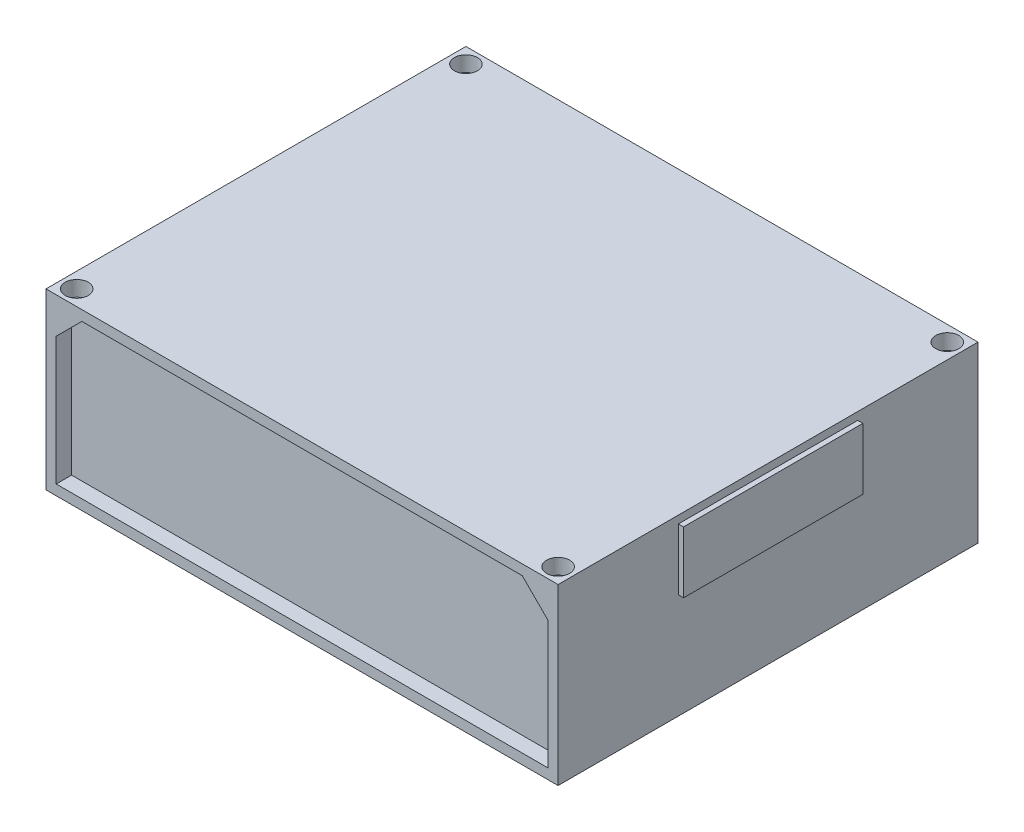
ISO-10303-21;
HEADER;
FILE_DESCRIPTION(('STEP AP214'),'2;1');
FILE_NAME('part.step','',(''),(''),'','','');
FILE_SCHEMA(('AUTOMOTIVE_DESIGN { 1 0 10303 214 1 1 1 1 }'));
ENDSEC;
DATA;
#1=APPLICATION_CONTEXT('core data for automotive mechanical design processes');
#2=APPLICATION_PROTOCOL_DEFINITION('international standard','automotive_design',2000,#1);
#3=PRODUCT_CONTEXT('',#1,'mechanical');
#4=PRODUCT('Part','Part','',(#3));
#5=PRODUCT_RELATED_PRODUCT_CATEGORY('part','',(#4));
#6=PRODUCT_DEFINITION_FORMATION('','',#4);
#7=PRODUCT_DEFINITION_CONTEXT('part definition',#1,'design');
#8=PRODUCT_DEFINITION('design','',#6,#7);
#9=PRODUCT_DEFINITION_SHAPE('','',#8);
#10=(LENGTH_UNIT() NAMED_UNIT(*) SI_UNIT(.MILLI.,.METRE.));
#11=(NAMED_UNIT(*) PLANE_ANGLE_UNIT() SI_UNIT($,.RADIAN.));
#12=(NAMED_UNIT(*) SI_UNIT($,.STERADIAN.) SOLID_ANGLE_UNIT());
#13=UNCERTAINTY_MEASURE_WITH_UNIT(LENGTH_MEASURE(1.E-05),#10,'distance_accuracy_value','');
#14=(GEOMETRIC_REPRESENTATION_CONTEXT(3) GLOBAL_UNCERTAINTY_ASSIGNED_CONTEXT((#13)) GLOBAL_UNIT_ASSIGNED_CONTEXT((#10,
#11,#12)) REPRESENTATION_CONTEXT('',''));
#15=CARTESIAN_POINT('',(0.,0.,0.));
#16=DIRECTION('',(0.,0.,1.));
#17=DIRECTION('',(1.,0.,0.));
#18=AXIS2_PLACEMENT_3D('',#15,#16,#17);
#19=CARTESIAN_POINT('',(100.,34.,0.));
#20=DIRECTION('',(-1.,0.,0.));
#21=DIRECTION('',(0.,0.,1.));
#22=AXIS2_PLACEMENT_3D('',#19,#20,#21);
#23=PLANE('',#22);
#24=DIRECTION('',(0.,0.,-1.));
#25=VECTOR('',#24,1.);
#26=CARTESIAN_POINT('',(100.,0.,0.));
#27=LINE('',#26,#25);
#28=CARTESIAN_POINT('',(100.,0.,0.));
#29=VERTEX_POINT('',#28);
#30=CARTESIAN_POINT('',(100.,0.,-82.));
#31=VERTEX_POINT('',#30);
#32=EDGE_CURVE('E342',#29,#31,#27,.T.);
#33=ORIENTED_EDGE('',*,*,#32,.T.);
#34=DIRECTION('',(0.,-1.,0.));
#35=VECTOR('',#34,1.);
#36=CARTESIAN_POINT('',(100.,34.,-82.));
#37=LINE('',#36,#35);
#38=CARTESIAN_POINT('',(100.,34.,-82.));
#39=VERTEX_POINT('',#38);
#40=EDGE_CURVE('E350',#39,#31,#37,.T.);
#41=ORIENTED_EDGE('',*,*,#40,.F.);
#42=DIRECTION('',(0.,0.,-1.));
#43=VECTOR('',#42,1.);
#44=CARTESIAN_POINT('',(100.,34.,0.));
#45=LINE('',#44,#43);
#46=CARTESIAN_POINT('',(100.,34.,0.));
#47=VERTEX_POINT('',#46);
#48=EDGE_CURVE('E329',#47,#39,#45,.T.);
#49=ORIENTED_EDGE('',*,*,#48,.F.);
#50=DIRECTION('',(0.,-1.,0.));
#51=VECTOR('',#50,1.);
#52=CARTESIAN_POINT('',(100.,34.,0.));
#53=LINE('',#52,#51);
#54=EDGE_CURVE('E354',#47,#29,#53,.T.);
#55=ORIENTED_EDGE('',*,*,#54,.T.);
#56=EDGE_LOOP('',(#33,#41,#49,#55));
#57=FACE_BOUND('',#56,.T.);
#58=DIRECTION('',(0.,-1.,0.));
#59=VECTOR('',#58,1.);
#60=CARTESIAN_POINT('',(100.,20.5,-23.5));
#61=LINE('',#60,#59);
#62=CARTESIAN_POINT('',(100.,32.5,-23.5));
#63=VERTEX_POINT('',#62);
#64=CARTESIAN_POINT('',(100.,20.5,-23.5));
#65=VERTEX_POINT('',#64);
#66=EDGE_CURVE('E207',#63,#65,#61,.T.);
#67=ORIENTED_EDGE('',*,*,#66,.F.);
#68=DIRECTION('',(0.,0.,1.));
#69=VECTOR('',#68,1.);
#70=CARTESIAN_POINT('',(100.,32.5,-58.5));
#71=LINE('',#70,#69);
#72=CARTESIAN_POINT('',(100.,32.5,-58.5));
#73=VERTEX_POINT('',#72);
#74=EDGE_CURVE('E204',#73,#63,#71,.T.);
#75=ORIENTED_EDGE('',*,*,#74,.F.);
#76=DIRECTION('',(0.,1.,0.));
#77=VECTOR('',#76,1.);
#78=CARTESIAN_POINT('',(100.,20.5,-58.5));
#79=LINE('',#78,#77);
#80=CARTESIAN_POINT('',(100.,20.5,-58.5));
#81=VERTEX_POINT('',#80);
#82=EDGE_CURVE('E69',#81,#73,#79,.T.);
#83=ORIENTED_EDGE('',*,*,#82,.F.);
#84=DIRECTION('',(0.,0.,-1.));
#85=VECTOR('',#84,1.);
#86=CARTESIAN_POINT('',(100.,20.5,-58.5));
#87=LINE('',#86,#85);
#88=EDGE_CURVE('E64',#65,#81,#87,.T.);
#89=ORIENTED_EDGE('',*,*,#88,.F.);
#90=EDGE_LOOP('',(#67,#75,#83,#89));
#91=FACE_BOUND('',#90,.T.);
#92=ADVANCED_FACE('F47',(#57,#91),#23,.F.);
#93=CARTESIAN_POINT('',(0.,34.,-82.));
#94=DIRECTION('',(0.,0.,1.));
#95=DIRECTION('',(1.,0.,0.));
#96=AXIS2_PLACEMENT_3D('',#93,#94,#95);
#97=PLANE('',#96);
#98=DIRECTION('',(-1.,0.,0.));
#99=VECTOR('',#98,1.);
#100=CARTESIAN_POINT('',(0.,0.,-82.));
#101=LINE('',#100,#99);
#102=CARTESIAN_POINT('',(0.,0.,-82.));
#103=VERTEX_POINT('',#102);
#104=EDGE_CURVE('E326',#31,#103,#101,.T.);
#105=ORIENTED_EDGE('',*,*,#104,.T.);
#106=DIRECTION('',(0.,-1.,0.));
#107=VECTOR('',#106,1.);
#108=CARTESIAN_POINT('',(0.,34.,-82.));
#109=LINE('',#108,#107);
#110=CARTESIAN_POINT('',(0.,34.,-82.));
#111=VERTEX_POINT('',#110);
#112=EDGE_CURVE('E335',#111,#103,#109,.T.);
#113=ORIENTED_EDGE('',*,*,#112,.F.);
#114=DIRECTION('',(-1.,0.,0.));
#115=VECTOR('',#114,1.);
#116=CARTESIAN_POINT('',(0.,34.,-82.));
#117=LINE('',#116,#115);
#118=EDGE_CURVE('E332',#39,#111,#117,.T.);
#119=ORIENTED_EDGE('',*,*,#118,.F.);
#120=ORIENTED_EDGE('',*,*,#40,.T.);
#121=EDGE_LOOP('',(#105,#113,#119,#120));
#122=FACE_BOUND('',#121,.T.);
#123=DIRECTION('',(-1.,0.,0.));
#124=VECTOR('',#123,1.);
#125=CARTESIAN_POINT('',(98.,32.,-82.));
#126=LINE('',#125,#124);
#127=CARTESIAN_POINT('',(93.,32.,-82.));
#128=VERTEX_POINT('',#127);
#129=CARTESIAN_POINT('',(6.99999999999999,32.,-82.));
#130=VERTEX_POINT('',#129);
#131=EDGE_CURVE('E266',#128,#130,#126,.T.);
#132=ORIENTED_EDGE('',*,*,#131,.T.);
#133=DIRECTION('',(0.707106781186543,0.707106781186552,0.));
#134=VECTOR('',#133,1.);
#135=CARTESIAN_POINT('',(4.50000000000005,29.5,-82.));
#136=LINE('',#135,#134);
#137=CARTESIAN_POINT('',(2.,26.9999999999999,-82.));
#138=VERTEX_POINT('',#137);
#139=EDGE_CURVE('E11',#130,#138,#136,.F.);
#140=ORIENTED_EDGE('',*,*,#139,.T.);
#141=DIRECTION('',(0.,-1.,0.));
#142=VECTOR('',#141,1.);
#143=CARTESIAN_POINT('',(2.,2.,-82.));
#144=LINE('',#143,#142);
#145=CARTESIAN_POINT('',(2.,2.,-82.));
#146=VERTEX_POINT('',#145);
#147=EDGE_CURVE('E244',#138,#146,#144,.T.);
#148=ORIENTED_EDGE('',*,*,#147,.T.);
#149=DIRECTION('',(1.,0.,0.));
#150=VECTOR('',#149,1.);
#151=CARTESIAN_POINT('',(98.,2.,-82.));
#152=LINE('',#151,#150);
#153=CARTESIAN_POINT('',(98.,2.,-82.));
#154=VERTEX_POINT('',#153);
#155=EDGE_CURVE('E252',#146,#154,#152,.T.);
#156=ORIENTED_EDGE('',*,*,#155,.T.);
#157=DIRECTION('',(0.,1.,0.));
#158=VECTOR('',#157,1.);
#159=CARTESIAN_POINT('',(98.,2.,-82.));
#160=LINE('',#159,#158);
#161=CARTESIAN_POINT('',(98.,27.,-82.));
#162=VERTEX_POINT('',#161);
#163=EDGE_CURVE('E270',#154,#162,#160,.T.);
#164=ORIENTED_EDGE('',*,*,#163,.T.);
#165=DIRECTION('',(0.70710678118655,-0.707106781186545,0.));
#166=VECTOR('',#165,1.);
#167=CARTESIAN_POINT('',(45.4999999999996,79.5,-82.));
#168=LINE('',#167,#166);
#169=EDGE_CURVE('E57',#162,#128,#168,.F.);
#170=ORIENTED_EDGE('',*,*,#169,.T.);
#171=EDGE_LOOP('',(#132,#140,#148,#156,#164,#170));
#172=FACE_BOUND('',#171,.T.);
#173=ADVANCED_FACE('F410',(#122,#172),#97,.F.);
#174=CARTESIAN_POINT('',(0.,34.,0.));
#175=DIRECTION('',(1.,0.,0.));
#176=DIRECTION('',(0.,0.,-1.));
#177=AXIS2_PLACEMENT_3D('',#174,#175,#176);
#178=PLANE('',#177);
#179=DIRECTION('',(0.,0.,1.));
#180=VECTOR('',#179,1.);
#181=CARTESIAN_POINT('',(0.,0.,0.));
#182=LINE('',#181,#180);
#183=CARTESIAN_POINT('',(0.,0.,0.));
#184=VERTEX_POINT('',#183);
#185=EDGE_CURVE('E317',#103,#184,#182,.T.);
#186=ORIENTED_EDGE('',*,*,#185,.T.);
#187=DIRECTION('',(0.,-1.,0.));
#188=VECTOR('',#187,1.);
#189=CARTESIAN_POINT('',(0.,34.,0.));
#190=LINE('',#189,#188);
#191=CARTESIAN_POINT('',(0.,34.,0.));
#192=VERTEX_POINT('',#191);
#193=EDGE_CURVE('E358',#192,#184,#190,.T.);
#194=ORIENTED_EDGE('',*,*,#193,.F.);
#195=DIRECTION('',(0.,0.,1.));
#196=VECTOR('',#195,1.);
#197=CARTESIAN_POINT('',(0.,34.,0.));
#198=LINE('',#197,#196);
#199=EDGE_CURVE('E321',#111,#192,#198,.T.);
#200=ORIENTED_EDGE('',*,*,#199,.F.);
#201=ORIENTED_EDGE('',*,*,#112,.T.);
#202=EDGE_LOOP('',(#186,#194,#200,#201));
#203=FACE_BOUND('',#202,.T.);
#204=ADVANCED_FACE('F458',(#203),#178,.F.);
#205=CARTESIAN_POINT('',(0.,34.,0.));
#206=DIRECTION('',(0.,0.,-1.));
#207=DIRECTION('',(-1.,0.,0.));
#208=AXIS2_PLACEMENT_3D('',#205,#206,#207);
#209=PLANE('',#208);
#210=DIRECTION('',(1.,0.,0.));
#211=VECTOR('',#210,1.);
#212=CARTESIAN_POINT('',(98.,2.,0.));
#213=LINE('',#212,#211);
#214=CARTESIAN_POINT('',(2.,2.,0.));
#215=VERTEX_POINT('',#214);
#216=CARTESIAN_POINT('',(98.,2.,0.));
#217=VERTEX_POINT('',#216);
#218=EDGE_CURVE('E303',#215,#217,#213,.T.);
#219=ORIENTED_EDGE('',*,*,#218,.F.);
#220=DIRECTION('',(0.,-1.,0.));
#221=VECTOR('',#220,1.);
#222=CARTESIAN_POINT('',(2.,2.,0.));
#223=LINE('',#222,#221);
#224=CARTESIAN_POINT('',(2.,26.9999999999999,0.));
#225=VERTEX_POINT('',#224);
#226=EDGE_CURVE('E281',#225,#215,#223,.T.);
#227=ORIENTED_EDGE('',*,*,#226,.F.);
#228=DIRECTION('',(-0.707106781186543,-0.707106781186552,0.));
#229=VECTOR('',#228,1.);
#230=CARTESIAN_POINT('',(4.50000000000005,29.5,0.));
#231=LINE('',#230,#229);
#232=CARTESIAN_POINT('',(6.99999999999999,32.,0.));
#233=VERTEX_POINT('',#232);
#234=EDGE_CURVE('E385',#225,#233,#231,.F.);
#235=ORIENTED_EDGE('',*,*,#234,.T.);
#236=DIRECTION('',(-1.,0.,0.));
#237=VECTOR('',#236,1.);
#238=CARTESIAN_POINT('',(98.,32.,0.));
#239=LINE('',#238,#237);
#240=CARTESIAN_POINT('',(93.,32.,0.));
#241=VERTEX_POINT('',#240);
#242=EDGE_CURVE('E288',#241,#233,#239,.T.);
#243=ORIENTED_EDGE('',*,*,#242,.F.);
#244=DIRECTION('',(-0.70710678118655,0.707106781186545,0.));
#245=VECTOR('',#244,1.);
#246=CARTESIAN_POINT('',(45.4999999999996,79.5,0.));
#247=LINE('',#246,#245);
#248=CARTESIAN_POINT('',(98.,27.,0.));
#249=VERTEX_POINT('',#248);
#250=EDGE_CURVE('E382',#241,#249,#247,.F.);
#251=ORIENTED_EDGE('',*,*,#250,.T.);
#252=DIRECTION('',(0.,1.,0.));
#253=VECTOR('',#252,1.);
#254=CARTESIAN_POINT('',(98.,2.,0.));
#255=LINE('',#254,#253);
#256=EDGE_CURVE('E307',#217,#249,#255,.T.);
#257=ORIENTED_EDGE('',*,*,#256,.F.);
#258=EDGE_LOOP('',(#219,#227,#235,#243,#251,#257));
#259=FACE_BOUND('',#258,.T.);
#260=DIRECTION('',(1.,0.,0.));
#261=VECTOR('',#260,1.);
#262=CARTESIAN_POINT('',(0.,0.,0.));
#263=LINE('',#262,#261);
#264=EDGE_CURVE('E339',#184,#29,#263,.T.);
#265=ORIENTED_EDGE('',*,*,#264,.T.);
#266=ORIENTED_EDGE('',*,*,#54,.F.);
#267=DIRECTION('',(1.,0.,0.));
#268=VECTOR('',#267,1.);
#269=CARTESIAN_POINT('',(0.,34.,0.));
#270=LINE('',#269,#268);
#271=EDGE_CURVE('E325',#192,#47,#270,.T.);
#272=ORIENTED_EDGE('',*,*,#271,.F.);
#273=ORIENTED_EDGE('',*,*,#193,.T.);
#274=EDGE_LOOP('',(#265,#266,#272,#273));
#275=FACE_BOUND('',#274,.T.);
#276=ADVANCED_FACE('F463',(#259,#275),#209,.F.);
#277=CARTESIAN_POINT('',(0.,34.,0.));
#278=DIRECTION('',(0.,-1.,0.));
#279=DIRECTION('',(0.,0.,-1.));
#280=AXIS2_PLACEMENT_3D('',#277,#278,#279);
#281=PLANE('',#280);
#282=CARTESIAN_POINT('',(97.,34.,-79.));
#283=DIRECTION('',(0.,1.,0.));
#284=DIRECTION('',(0.,0.,1.));
#285=AXIS2_PLACEMENT_3D('',#282,#283,#284);
#286=CIRCLE('',#285,2.25);
#287=CARTESIAN_POINT('',(97.,34.,-76.75));
#288=VERTEX_POINT('',#287);
#289=EDGE_CURVE('E214',#288,#288,#286,.T.);
#290=ORIENTED_EDGE('',*,*,#289,.F.);
#291=EDGE_LOOP('',(#290));
#292=FACE_BOUND('',#291,.T.);
#293=CARTESIAN_POINT('',(97.,34.,-3.));
#294=DIRECTION('',(0.,1.,0.));
#295=DIRECTION('',(0.,0.,1.));
#296=AXIS2_PLACEMENT_3D('',#293,#294,#295);
#297=CIRCLE('',#296,2.25);
#298=CARTESIAN_POINT('',(97.,34.,-0.750000000000003));
#299=VERTEX_POINT('',#298);
#300=EDGE_CURVE('E229',#299,#299,#297,.T.);
#301=ORIENTED_EDGE('',*,*,#300,.F.);
#302=EDGE_LOOP('',(#301));
#303=FACE_BOUND('',#302,.T.);
#304=CARTESIAN_POINT('',(3.,34.,-3.));
#305=DIRECTION('',(0.,1.,0.));
#306=DIRECTION('',(0.,0.,1.));
#307=AXIS2_PLACEMENT_3D('',#304,#305,#306);
#308=CIRCLE('',#307,2.25);
#309=CARTESIAN_POINT('',(3.,34.,-0.749999999999999));
#310=VERTEX_POINT('',#309);
#311=EDGE_CURVE('E220',#310,#310,#308,.T.);
#312=ORIENTED_EDGE('',*,*,#311,.F.);
#313=EDGE_LOOP('',(#312));
#314=FACE_BOUND('',#313,.T.);
#315=CARTESIAN_POINT('',(3.,34.,-79.));
#316=DIRECTION('',(0.,1.,0.));
#317=DIRECTION('',(0.,0.,1.));
#318=AXIS2_PLACEMENT_3D('',#315,#316,#317);
#319=CIRCLE('',#318,2.25);
#320=CARTESIAN_POINT('',(3.,34.,-76.75));
#321=VERTEX_POINT('',#320);
#322=EDGE_CURVE('E224',#321,#321,#319,.T.);
#323=ORIENTED_EDGE('',*,*,#322,.F.);
#324=EDGE_LOOP('',(#323));
#325=FACE_BOUND('',#324,.T.);
#326=ORIENTED_EDGE('',*,*,#199,.T.);
#327=ORIENTED_EDGE('',*,*,#271,.T.);
#328=ORIENTED_EDGE('',*,*,#48,.T.);
#329=ORIENTED_EDGE('',*,*,#118,.T.);
#330=EDGE_LOOP('',(#326,#327,#328,#329));
#331=FACE_BOUND('',#330,.T.);
#332=ADVANCED_FACE('F466',(#292,#303,#314,#325,#331),#281,.F.);
#333=CARTESIAN_POINT('',(0.,0.,0.));
#334=DIRECTION('',(0.,-1.,0.));
#335=DIRECTION('',(0.,0.,-1.));
#336=AXIS2_PLACEMENT_3D('',#333,#334,#335);
#337=PLANE('',#336);
#338=ORIENTED_EDGE('',*,*,#185,.F.);
#339=ORIENTED_EDGE('',*,*,#104,.F.);
#340=ORIENTED_EDGE('',*,*,#32,.F.);
#341=ORIENTED_EDGE('',*,*,#264,.F.);
#342=EDGE_LOOP('',(#338,#339,#340,#341));
#343=FACE_BOUND('',#342,.T.);
#344=ADVANCED_FACE('F534',(#343),#337,.T.);
#345=CARTESIAN_POINT('',(2.,2.,-3.));
#346=DIRECTION('',(-1.,0.,0.));
#347=DIRECTION('',(0.,0.,1.));
#348=AXIS2_PLACEMENT_3D('',#345,#346,#347);
#349=PLANE('',#348);
#350=DIRECTION('',(0.,-1.,0.));
#351=VECTOR('',#350,1.);
#352=CARTESIAN_POINT('',(2.,2.,-3.));
#353=LINE('',#352,#351);
#354=CARTESIAN_POINT('',(2.,26.9999999999999,-3.));
#355=VERTEX_POINT('',#354);
#356=CARTESIAN_POINT('',(2.,2.,-3.));
#357=VERTEX_POINT('',#356);
#358=EDGE_CURVE('E284',#355,#357,#353,.T.);
#359=ORIENTED_EDGE('',*,*,#358,.F.);
#360=DIRECTION('',(0.,0.,1.));
#361=VECTOR('',#360,1.);
#362=CARTESIAN_POINT('',(2.,26.9999999999999,0.));
#363=LINE('',#362,#361);
#364=EDGE_CURVE('E378',#355,#225,#363,.T.);
#365=ORIENTED_EDGE('',*,*,#364,.T.);
#366=ORIENTED_EDGE('',*,*,#226,.T.);
#367=DIRECTION('',(0.,0.,1.));
#368=VECTOR('',#367,1.);
#369=CARTESIAN_POINT('',(2.,2.,-3.));
#370=LINE('',#369,#368);
#371=EDGE_CURVE('E300',#357,#215,#370,.T.);
#372=ORIENTED_EDGE('',*,*,#371,.F.);
#373=EDGE_LOOP('',(#359,#365,#366,#372));
#374=FACE_BOUND('',#373,.T.);
#375=ADVANCED_FACE('F784',(#374),#349,.F.);
#376=CARTESIAN_POINT('',(98.,32.,-3.));
#377=DIRECTION('',(0.,1.,0.));
#378=DIRECTION('',(0.,0.,1.));
#379=AXIS2_PLACEMENT_3D('',#376,#377,#378);
#380=PLANE('',#379);
#381=DIRECTION('',(-1.,0.,0.));
#382=VECTOR('',#381,1.);
#383=CARTESIAN_POINT('',(98.,32.,-3.));
#384=LINE('',#383,#382);
#385=CARTESIAN_POINT('',(93.,32.,-3.));
#386=VERTEX_POINT('',#385);
#387=CARTESIAN_POINT('',(6.99999999999999,32.,-3.));
#388=VERTEX_POINT('',#387);
#389=EDGE_CURVE('E296',#386,#388,#384,.T.);
#390=ORIENTED_EDGE('',*,*,#389,.F.);
#391=DIRECTION('',(0.,0.,1.));
#392=VECTOR('',#391,1.);
#393=CARTESIAN_POINT('',(93.,32.,0.));
#394=LINE('',#393,#392);
#395=EDGE_CURVE('E365',#386,#241,#394,.T.);
#396=ORIENTED_EDGE('',*,*,#395,.T.);
#397=ORIENTED_EDGE('',*,*,#242,.T.);
#398=DIRECTION('',(0.,0.,-1.));
#399=VECTOR('',#398,1.);
#400=CARTESIAN_POINT('',(6.99999999999999,32.,-3.));
#401=LINE('',#400,#399);
#402=EDGE_CURVE('E362',#233,#388,#401,.T.);
#403=ORIENTED_EDGE('',*,*,#402,.T.);
#404=EDGE_LOOP('',(#390,#396,#397,#403));
#405=FACE_BOUND('',#404,.T.);
#406=ADVANCED_FACE('F774',(#405),#380,.F.);
#407=CARTESIAN_POINT('',(98.,2.,-3.));
#408=DIRECTION('',(1.,0.,0.));
#409=DIRECTION('',(0.,0.,-1.));
#410=AXIS2_PLACEMENT_3D('',#407,#408,#409);
#411=PLANE('',#410);
#412=ORIENTED_EDGE('',*,*,#256,.T.);
#413=DIRECTION('',(0.,0.,-1.));
#414=VECTOR('',#413,1.);
#415=CARTESIAN_POINT('',(98.,27.,-3.));
#416=LINE('',#415,#414);
#417=CARTESIAN_POINT('',(98.,27.,-3.));
#418=VERTEX_POINT('',#417);
#419=EDGE_CURVE('E369',#249,#418,#416,.T.);
#420=ORIENTED_EDGE('',*,*,#419,.T.);
#421=DIRECTION('',(0.,1.,0.));
#422=VECTOR('',#421,1.);
#423=CARTESIAN_POINT('',(98.,2.,-3.));
#424=LINE('',#423,#422);
#425=CARTESIAN_POINT('',(98.,2.,-3.));
#426=VERTEX_POINT('',#425);
#427=EDGE_CURVE('E292',#426,#418,#424,.T.);
#428=ORIENTED_EDGE('',*,*,#427,.F.);
#429=DIRECTION('',(0.,0.,1.));
#430=VECTOR('',#429,1.);
#431=CARTESIAN_POINT('',(98.,2.,-3.));
#432=LINE('',#431,#430);
#433=EDGE_CURVE('E314',#426,#217,#432,.T.);
#434=ORIENTED_EDGE('',*,*,#433,.T.);
#435=EDGE_LOOP('',(#412,#420,#428,#434));
#436=FACE_BOUND('',#435,.T.);
#437=ADVANCED_FACE('F764',(#436),#411,.F.);
#438=CARTESIAN_POINT('',(98.,2.,-3.));
#439=DIRECTION('',(0.,-1.,0.));
#440=DIRECTION('',(0.,0.,-1.));
#441=AXIS2_PLACEMENT_3D('',#438,#439,#440);
#442=PLANE('',#441);
#443=ORIENTED_EDGE('',*,*,#218,.T.);
#444=ORIENTED_EDGE('',*,*,#433,.F.);
#445=DIRECTION('',(1.,0.,0.));
#446=VECTOR('',#445,1.);
#447=CARTESIAN_POINT('',(98.,2.,-3.));
#448=LINE('',#447,#446);
#449=EDGE_CURVE('E287',#357,#426,#448,.T.);
#450=ORIENTED_EDGE('',*,*,#449,.F.);
#451=ORIENTED_EDGE('',*,*,#371,.T.);
#452=EDGE_LOOP('',(#443,#444,#450,#451));
#453=FACE_BOUND('',#452,.T.);
#454=ADVANCED_FACE('F755',(#453),#442,.F.);
#455=CARTESIAN_POINT('',(0.,0.,-3.));
#456=DIRECTION('',(0.,0.,1.));
#457=DIRECTION('',(1.,0.,0.));
#458=AXIS2_PLACEMENT_3D('',#455,#456,#457);
#459=PLANE('',#458);
#460=ORIENTED_EDGE('',*,*,#427,.T.);
#461=DIRECTION('',(0.70710678118655,-0.707106781186545,0.));
#462=VECTOR('',#461,1.);
#463=CARTESIAN_POINT('',(62.4999999999996,62.5000000000001,-3.));
#464=LINE('',#463,#462);
#465=EDGE_CURVE('E375',#418,#386,#464,.F.);
#466=ORIENTED_EDGE('',*,*,#465,.T.);
#467=ORIENTED_EDGE('',*,*,#389,.T.);
#468=DIRECTION('',(0.707106781186543,0.707106781186552,0.));
#469=VECTOR('',#468,1.);
#470=CARTESIAN_POINT('',(-12.5,12.4999999999998,-3.));
#471=LINE('',#470,#469);
#472=EDGE_CURVE('E372',#388,#355,#471,.F.);
#473=ORIENTED_EDGE('',*,*,#472,.T.);
#474=ORIENTED_EDGE('',*,*,#358,.T.);
#475=ORIENTED_EDGE('',*,*,#449,.T.);
#476=EDGE_LOOP('',(#460,#466,#467,#473,#474,#475));
#477=FACE_BOUND('',#476,.T.);
#478=ADVANCED_FACE('F476',(#477),#459,.T.);
#479=CARTESIAN_POINT('',(93.,32.,-3.));
#480=DIRECTION('',(-0.707106781186545,-0.70710678118655,0.));
#481=DIRECTION('',(0.,0.,-1.));
#482=AXIS2_PLACEMENT_3D('',#479,#480,#481);
#483=PLANE('',#482);
#484=ORIENTED_EDGE('',*,*,#465,.F.);
#485=ORIENTED_EDGE('',*,*,#419,.F.);
#486=ORIENTED_EDGE('',*,*,#250,.F.);
#487=ORIENTED_EDGE('',*,*,#395,.F.);
#488=EDGE_LOOP('',(#484,#485,#486,#487));
#489=FACE_BOUND('',#488,.T.);
#490=ADVANCED_FACE('F447',(#489),#483,.T.);
#491=CARTESIAN_POINT('',(2.,26.9999999999999,-3.));
#492=DIRECTION('',(0.707106781186552,-0.707106781186543,0.));
#493=DIRECTION('',(0.,0.,-1.));
#494=AXIS2_PLACEMENT_3D('',#491,#492,#493);
#495=PLANE('',#494);
#496=ORIENTED_EDGE('',*,*,#472,.F.);
#497=ORIENTED_EDGE('',*,*,#402,.F.);
#498=ORIENTED_EDGE('',*,*,#234,.F.);
#499=ORIENTED_EDGE('',*,*,#364,.F.);
#500=EDGE_LOOP('',(#496,#497,#498,#499));
#501=FACE_BOUND('',#500,.T.);
#502=ADVANCED_FACE('F440',(#501),#495,.T.);
#503=CARTESIAN_POINT('',(2.,2.,-79.));
#504=DIRECTION('',(1.,0.,0.));
#505=DIRECTION('',(0.,0.,-1.));
#506=AXIS2_PLACEMENT_3D('',#503,#504,#505);
#507=PLANE('',#506);
#508=ORIENTED_EDGE('',*,*,#147,.F.);
#509=DIRECTION('',(0.,0.,1.));
#510=VECTOR('',#509,1.);
#511=CARTESIAN_POINT('',(2.,26.9999999999999,-79.));
#512=LINE('',#511,#510);
#513=CARTESIAN_POINT('',(2.,26.9999999999999,-79.));
#514=VERTEX_POINT('',#513);
#515=EDGE_CURVE('E405',#138,#514,#512,.T.);
#516=ORIENTED_EDGE('',*,*,#515,.T.);
#517=DIRECTION('',(0.,-1.,0.));
#518=VECTOR('',#517,1.);
#519=CARTESIAN_POINT('',(2.,2.,-79.));
#520=LINE('',#519,#518);
#521=CARTESIAN_POINT('',(2.,2.,-79.));
#522=VERTEX_POINT('',#521);
#523=EDGE_CURVE('E248',#514,#522,#520,.T.);
#524=ORIENTED_EDGE('',*,*,#523,.T.);
#525=DIRECTION('',(0.,0.,-1.));
#526=VECTOR('',#525,1.);
#527=CARTESIAN_POINT('',(2.,2.,-79.));
#528=LINE('',#527,#526);
#529=EDGE_CURVE('E277',#522,#146,#528,.T.);
#530=ORIENTED_EDGE('',*,*,#529,.T.);
#531=EDGE_LOOP('',(#508,#516,#524,#530));
#532=FACE_BOUND('',#531,.T.);
#533=ADVANCED_FACE('F438',(#532),#507,.T.);
#534=CARTESIAN_POINT('',(98.,2.,-79.));
#535=DIRECTION('',(0.,1.,0.));
#536=DIRECTION('',(0.,0.,1.));
#537=AXIS2_PLACEMENT_3D('',#534,#535,#536);
#538=PLANE('',#537);
#539=ORIENTED_EDGE('',*,*,#155,.F.);
#540=ORIENTED_EDGE('',*,*,#529,.F.);
#541=DIRECTION('',(1.,0.,0.));
#542=VECTOR('',#541,1.);
#543=CARTESIAN_POINT('',(98.,2.,-79.));
#544=LINE('',#543,#542);
#545=CARTESIAN_POINT('',(98.,2.,-79.));
#546=VERTEX_POINT('',#545);
#547=EDGE_CURVE('E260',#522,#546,#544,.T.);
#548=ORIENTED_EDGE('',*,*,#547,.T.);
#549=DIRECTION('',(0.,0.,-1.));
#550=VECTOR('',#549,1.);
#551=CARTESIAN_POINT('',(98.,2.,-79.));
#552=LINE('',#551,#550);
#553=EDGE_CURVE('E263',#546,#154,#552,.T.);
#554=ORIENTED_EDGE('',*,*,#553,.T.);
#555=EDGE_LOOP('',(#539,#540,#548,#554));
#556=FACE_BOUND('',#555,.T.);
#557=ADVANCED_FACE('F430',(#556),#538,.T.);
#558=CARTESIAN_POINT('',(98.,2.,-79.));
#559=DIRECTION('',(-1.,0.,0.));
#560=DIRECTION('',(0.,0.,1.));
#561=AXIS2_PLACEMENT_3D('',#558,#559,#560);
#562=PLANE('',#561);
#563=DIRECTION('',(0.,1.,0.));
#564=VECTOR('',#563,1.);
#565=CARTESIAN_POINT('',(98.,2.,-79.));
#566=LINE('',#565,#564);
#567=CARTESIAN_POINT('',(98.,27.,-79.));
#568=VERTEX_POINT('',#567);
#569=EDGE_CURVE('E256',#546,#568,#566,.T.);
#570=ORIENTED_EDGE('',*,*,#569,.T.);
#571=DIRECTION('',(0.,0.,-1.));
#572=VECTOR('',#571,1.);
#573=CARTESIAN_POINT('',(98.,27.,-82.));
#574=LINE('',#573,#572);
#575=EDGE_CURVE('E388',#568,#162,#574,.T.);
#576=ORIENTED_EDGE('',*,*,#575,.T.);
#577=ORIENTED_EDGE('',*,*,#163,.F.);
#578=ORIENTED_EDGE('',*,*,#553,.F.);
#579=EDGE_LOOP('',(#570,#576,#577,#578));
#580=FACE_BOUND('',#579,.T.);
#581=ADVANCED_FACE('F427',(#580),#562,.T.);
#582=CARTESIAN_POINT('',(98.,32.,-79.));
#583=DIRECTION('',(0.,-1.,0.));
#584=DIRECTION('',(0.,0.,-1.));
#585=AXIS2_PLACEMENT_3D('',#582,#583,#584);
#586=PLANE('',#585);
#587=ORIENTED_EDGE('',*,*,#131,.F.);
#588=DIRECTION('',(0.,0.,1.));
#589=VECTOR('',#588,1.);
#590=CARTESIAN_POINT('',(93.,32.,-79.));
#591=LINE('',#590,#589);
#592=CARTESIAN_POINT('',(93.,32.,-79.));
#593=VERTEX_POINT('',#592);
#594=EDGE_CURVE('E396',#128,#593,#591,.T.);
#595=ORIENTED_EDGE('',*,*,#594,.T.);
#596=DIRECTION('',(-1.,0.,0.));
#597=VECTOR('',#596,1.);
#598=CARTESIAN_POINT('',(98.,32.,-79.));
#599=LINE('',#598,#597);
#600=CARTESIAN_POINT('',(6.99999999999999,32.,-79.));
#601=VERTEX_POINT('',#600);
#602=EDGE_CURVE('E251',#593,#601,#599,.T.);
#603=ORIENTED_EDGE('',*,*,#602,.T.);
#604=DIRECTION('',(0.,0.,-1.));
#605=VECTOR('',#604,1.);
#606=CARTESIAN_POINT('',(6.99999999999999,32.,-82.));
#607=LINE('',#606,#605);
#608=EDGE_CURVE('E392',#601,#130,#607,.T.);
#609=ORIENTED_EDGE('',*,*,#608,.T.);
#610=EDGE_LOOP('',(#587,#595,#603,#609));
#611=FACE_BOUND('',#610,.T.);
#612=ADVANCED_FACE('F416',(#611),#586,.T.);
#613=CARTESIAN_POINT('',(0.,0.,-79.));
#614=DIRECTION('',(0.,0.,-1.));
#615=DIRECTION('',(1.,0.,0.));
#616=AXIS2_PLACEMENT_3D('',#613,#614,#615);
#617=PLANE('',#616);
#618=ORIENTED_EDGE('',*,*,#602,.F.);
#619=DIRECTION('',(-0.70710678118655,0.707106781186545,0.));
#620=VECTOR('',#619,1.);
#621=CARTESIAN_POINT('',(62.4999999999996,62.5000000000001,-79.));
#622=LINE('',#621,#620);
#623=EDGE_CURVE('E402',#593,#568,#622,.F.);
#624=ORIENTED_EDGE('',*,*,#623,.T.);
#625=ORIENTED_EDGE('',*,*,#569,.F.);
#626=ORIENTED_EDGE('',*,*,#547,.F.);
#627=ORIENTED_EDGE('',*,*,#523,.F.);
#628=DIRECTION('',(-0.707106781186543,-0.707106781186552,0.));
#629=VECTOR('',#628,1.);
#630=CARTESIAN_POINT('',(-12.5,12.4999999999998,-79.));
#631=LINE('',#630,#629);
#632=EDGE_CURVE('E399',#514,#601,#631,.F.);
#633=ORIENTED_EDGE('',*,*,#632,.T.);
#634=EDGE_LOOP('',(#618,#624,#625,#626,#627,#633));
#635=FACE_BOUND('',#634,.T.);
#636=ADVANCED_FACE('F423',(#635),#617,.T.);
#637=CARTESIAN_POINT('',(98.,27.,-79.));
#638=DIRECTION('',(-0.707106781186545,-0.70710678118655,0.));
#639=DIRECTION('',(0.,0.,1.));
#640=AXIS2_PLACEMENT_3D('',#637,#638,#639);
#641=PLANE('',#640);
#642=ORIENTED_EDGE('',*,*,#623,.F.);
#643=ORIENTED_EDGE('',*,*,#594,.F.);
#644=ORIENTED_EDGE('',*,*,#169,.F.);
#645=ORIENTED_EDGE('',*,*,#575,.F.);
#646=EDGE_LOOP('',(#642,#643,#644,#645));
#647=FACE_BOUND('',#646,.T.);
#648=ADVANCED_FACE('F420',(#647),#641,.T.);
#649=CARTESIAN_POINT('',(6.99999999999999,32.,-79.));
#650=DIRECTION('',(0.707106781186552,-0.707106781186543,0.));
#651=DIRECTION('',(0.,0.,1.));
#652=AXIS2_PLACEMENT_3D('',#649,#650,#651);
#653=PLANE('',#652);
#654=ORIENTED_EDGE('',*,*,#632,.F.);
#655=ORIENTED_EDGE('',*,*,#515,.F.);
#656=ORIENTED_EDGE('',*,*,#139,.F.);
#657=ORIENTED_EDGE('',*,*,#608,.F.);
#658=EDGE_LOOP('',(#654,#655,#656,#657));
#659=FACE_BOUND('',#658,.T.);
#660=ADVANCED_FACE('F50',(#659),#653,.T.);
#661=CARTESIAN_POINT('',(3.,31.,-79.));
#662=DIRECTION('',(0.,1.,0.));
#663=DIRECTION('',(0.,0.,1.));
#664=AXIS2_PLACEMENT_3D('',#661,#662,#663);
#665=CYLINDRICAL_SURFACE('',#664,2.25);
#666=CARTESIAN_POINT('',(3.,31.,-79.));
#667=DIRECTION('',(0.,1.,0.));
#668=DIRECTION('',(0.,0.,1.));
#669=AXIS2_PLACEMENT_3D('',#666,#667,#668);
#670=CIRCLE('',#669,2.25);
#671=CARTESIAN_POINT('',(3.,31.,-76.75));
#672=VERTEX_POINT('',#671);
#673=EDGE_CURVE('E240',#672,#672,#670,.T.);
#674=ORIENTED_EDGE('',*,*,#673,.F.);
#675=EDGE_LOOP('',(#674));
#676=FACE_BOUND('',#675,.T.);
#677=ORIENTED_EDGE('',*,*,#322,.T.);
#678=EDGE_LOOP('',(#677));
#679=FACE_BOUND('',#678,.T.);
#680=ADVANCED_FACE('F488',(#676,#679),#665,.F.);
#681=CARTESIAN_POINT('',(3.,31.,-79.));
#682=DIRECTION('',(0.,1.,0.));
#683=DIRECTION('',(0.,0.,1.));
#684=AXIS2_PLACEMENT_3D('',#681,#682,#683);
#685=PLANE('',#684);
#686=ORIENTED_EDGE('',*,*,#673,.T.);
#687=EDGE_LOOP('',(#686));
#688=FACE_BOUND('',#687,.T.);
#689=ADVANCED_FACE('F546',(#688),#685,.T.);
#690=CARTESIAN_POINT('',(3.,31.,-3.));
#691=DIRECTION('',(0.,1.,0.));
#692=DIRECTION('',(0.,0.,1.));
#693=AXIS2_PLACEMENT_3D('',#690,#691,#692);
#694=CYLINDRICAL_SURFACE('',#693,2.25);
#695=CARTESIAN_POINT('',(3.,31.,-3.));
#696=DIRECTION('',(0.,1.,0.));
#697=DIRECTION('',(0.,0.,1.));
#698=AXIS2_PLACEMENT_3D('',#695,#696,#697);
#699=CIRCLE('',#698,2.25);
#700=CARTESIAN_POINT('',(3.,31.,-0.749999999999999));
#701=VERTEX_POINT('',#700);
#702=EDGE_CURVE('E225',#701,#701,#699,.T.);
#703=ORIENTED_EDGE('',*,*,#702,.F.);
#704=EDGE_LOOP('',(#703));
#705=FACE_BOUND('',#704,.T.);
#706=ORIENTED_EDGE('',*,*,#311,.T.);
#707=EDGE_LOOP('',(#706));
#708=FACE_BOUND('',#707,.T.);
#709=ADVANCED_FACE('F556',(#705,#708),#694,.F.);
#710=CARTESIAN_POINT('',(3.,31.,-3.));
#711=DIRECTION('',(0.,1.,0.));
#712=DIRECTION('',(0.,0.,1.));
#713=AXIS2_PLACEMENT_3D('',#710,#711,#712);
#714=PLANE('',#713);
#715=ORIENTED_EDGE('',*,*,#702,.T.);
#716=EDGE_LOOP('',(#715));
#717=FACE_BOUND('',#716,.T.);
#718=ADVANCED_FACE('F566',(#717),#714,.T.);
#719=CARTESIAN_POINT('',(97.,31.,-3.));
#720=DIRECTION('',(0.,1.,0.));
#721=DIRECTION('',(0.,0.,1.));
#722=AXIS2_PLACEMENT_3D('',#719,#720,#721);
#723=CYLINDRICAL_SURFACE('',#722,2.25);
#724=CARTESIAN_POINT('',(97.,31.,-3.));
#725=DIRECTION('',(0.,1.,0.));
#726=DIRECTION('',(0.,0.,1.));
#727=AXIS2_PLACEMENT_3D('',#724,#725,#726);
#728=CIRCLE('',#727,2.25);
#729=CARTESIAN_POINT('',(97.,31.,-0.750000000000003));
#730=VERTEX_POINT('',#729);
#731=EDGE_CURVE('E233',#730,#730,#728,.T.);
#732=ORIENTED_EDGE('',*,*,#731,.F.);
#733=EDGE_LOOP('',(#732));
#734=FACE_BOUND('',#733,.T.);
#735=ORIENTED_EDGE('',*,*,#300,.T.);
#736=EDGE_LOOP('',(#735));
#737=FACE_BOUND('',#736,.T.);
#738=ADVANCED_FACE('F577',(#734,#737),#723,.F.);
#739=CARTESIAN_POINT('',(97.,31.,-3.));
#740=DIRECTION('',(0.,1.,0.));
#741=DIRECTION('',(0.,0.,1.));
#742=AXIS2_PLACEMENT_3D('',#739,#740,#741);
#743=PLANE('',#742);
#744=ORIENTED_EDGE('',*,*,#731,.T.);
#745=EDGE_LOOP('',(#744));
#746=FACE_BOUND('',#745,.T.);
#747=ADVANCED_FACE('F588',(#746),#743,.T.);
#748=CARTESIAN_POINT('',(97.,31.,-79.));
#749=DIRECTION('',(0.,1.,0.));
#750=DIRECTION('',(0.,0.,1.));
#751=AXIS2_PLACEMENT_3D('',#748,#749,#750);
#752=CYLINDRICAL_SURFACE('',#751,2.25);
#753=CARTESIAN_POINT('',(97.,31.,-79.));
#754=DIRECTION('',(0.,1.,0.));
#755=DIRECTION('',(0.,0.,1.));
#756=AXIS2_PLACEMENT_3D('',#753,#754,#755);
#757=CIRCLE('',#756,2.25);
#758=CARTESIAN_POINT('',(97.,31.,-76.75));
#759=VERTEX_POINT('',#758);
#760=EDGE_CURVE('E209',#759,#759,#757,.T.);
#761=ORIENTED_EDGE('',*,*,#760,.F.);
#762=EDGE_LOOP('',(#761));
#763=FACE_BOUND('',#762,.T.);
#764=ORIENTED_EDGE('',*,*,#289,.T.);
#765=EDGE_LOOP('',(#764));
#766=FACE_BOUND('',#765,.T.);
#767=ADVANCED_FACE('F599',(#763,#766),#752,.F.);
#768=CARTESIAN_POINT('',(97.,31.,-79.));
#769=DIRECTION('',(0.,1.,0.));
#770=DIRECTION('',(0.,0.,1.));
#771=AXIS2_PLACEMENT_3D('',#768,#769,#770);
#772=PLANE('',#771);
#773=ORIENTED_EDGE('',*,*,#760,.T.);
#774=EDGE_LOOP('',(#773));
#775=FACE_BOUND('',#774,.T.);
#776=ADVANCED_FACE('F610',(#775),#772,.T.);
#777=CARTESIAN_POINT('',(101.,20.5,-23.5));
#778=DIRECTION('',(0.,0.,-1.));
#779=DIRECTION('',(-1.,0.,0.));
#780=AXIS2_PLACEMENT_3D('',#777,#778,#779);
#781=PLANE('',#780);
#782=ORIENTED_EDGE('',*,*,#66,.T.);
#783=DIRECTION('',(-1.,0.,0.));
#784=VECTOR('',#783,1.);
#785=CARTESIAN_POINT('',(101.,20.5,-23.5));
#786=LINE('',#785,#784);
#787=CARTESIAN_POINT('',(101.,20.5,-23.5));
#788=VERTEX_POINT('',#787);
#789=EDGE_CURVE('E186',#788,#65,#786,.T.);
#790=ORIENTED_EDGE('',*,*,#789,.F.);
#791=DIRECTION('',(0.,-1.,0.));
#792=VECTOR('',#791,1.);
#793=CARTESIAN_POINT('',(101.,20.5,-23.5));
#794=LINE('',#793,#792);
#795=CARTESIAN_POINT('',(101.,32.5,-23.5));
#796=VERTEX_POINT('',#795);
#797=EDGE_CURVE('E194',#796,#788,#794,.T.);
#798=ORIENTED_EDGE('',*,*,#797,.F.);
#799=DIRECTION('',(-1.,0.,0.));
#800=VECTOR('',#799,1.);
#801=CARTESIAN_POINT('',(101.,32.5,-23.5));
#802=LINE('',#801,#800);
#803=EDGE_CURVE('E686',#796,#63,#802,.T.);
#804=ORIENTED_EDGE('',*,*,#803,.T.);
#805=EDGE_LOOP('',(#782,#790,#798,#804));
#806=FACE_BOUND('',#805,.T.);
#807=ADVANCED_FACE('F206',(#806),#781,.F.);
#808=CARTESIAN_POINT('',(101.,20.5,-58.5));
#809=DIRECTION('',(0.,1.,0.));
#810=DIRECTION('',(0.,0.,1.));
#811=AXIS2_PLACEMENT_3D('',#808,#809,#810);
#812=PLANE('',#811);
#813=ORIENTED_EDGE('',*,*,#88,.T.);
#814=DIRECTION('',(-1.,0.,0.));
#815=VECTOR('',#814,1.);
#816=CARTESIAN_POINT('',(101.,20.5,-58.5));
#817=LINE('',#816,#815);
#818=CARTESIAN_POINT('',(101.,20.5,-58.5));
#819=VERTEX_POINT('',#818);
#820=EDGE_CURVE('E189',#819,#81,#817,.T.);
#821=ORIENTED_EDGE('',*,*,#820,.F.);
#822=DIRECTION('',(0.,0.,-1.));
#823=VECTOR('',#822,1.);
#824=CARTESIAN_POINT('',(101.,20.5,-58.5));
#825=LINE('',#824,#823);
#826=EDGE_CURVE('E182',#788,#819,#825,.T.);
#827=ORIENTED_EDGE('',*,*,#826,.F.);
#828=ORIENTED_EDGE('',*,*,#789,.T.);
#829=EDGE_LOOP('',(#813,#821,#827,#828));
#830=FACE_BOUND('',#829,.T.);
#831=ADVANCED_FACE('F184',(#830),#812,.F.);
#832=CARTESIAN_POINT('',(101.,20.5,-58.5));
#833=DIRECTION('',(0.,0.,1.));
#834=DIRECTION('',(1.,0.,0.));
#835=AXIS2_PLACEMENT_3D('',#832,#833,#834);
#836=PLANE('',#835);
#837=ORIENTED_EDGE('',*,*,#82,.T.);
#838=DIRECTION('',(-1.,0.,0.));
#839=VECTOR('',#838,1.);
#840=CARTESIAN_POINT('',(101.,32.5,-58.5));
#841=LINE('',#840,#839);
#842=CARTESIAN_POINT('',(101.,32.5,-58.5));
#843=VERTEX_POINT('',#842);
#844=EDGE_CURVE('E216',#843,#73,#841,.T.);
#845=ORIENTED_EDGE('',*,*,#844,.F.);
#846=DIRECTION('',(0.,1.,0.));
#847=VECTOR('',#846,1.);
#848=CARTESIAN_POINT('',(101.,20.5,-58.5));
#849=LINE('',#848,#847);
#850=EDGE_CURVE('E193',#819,#843,#849,.T.);
#851=ORIENTED_EDGE('',*,*,#850,.F.);
#852=ORIENTED_EDGE('',*,*,#820,.T.);
#853=EDGE_LOOP('',(#837,#845,#851,#852));
#854=FACE_BOUND('',#853,.T.);
#855=ADVANCED_FACE('F644',(#854),#836,.F.);
#856=CARTESIAN_POINT('',(101.,32.5,-58.5));
#857=DIRECTION('',(0.,-1.,0.));
#858=DIRECTION('',(0.,0.,-1.));
#859=AXIS2_PLACEMENT_3D('',#856,#857,#858);
#860=PLANE('',#859);
#861=ORIENTED_EDGE('',*,*,#74,.T.);
#862=ORIENTED_EDGE('',*,*,#803,.F.);
#863=DIRECTION('',(0.,0.,1.));
#864=VECTOR('',#863,1.);
#865=CARTESIAN_POINT('',(101.,32.5,-58.5));
#866=LINE('',#865,#864);
#867=EDGE_CURVE('E199',#843,#796,#866,.T.);
#868=ORIENTED_EDGE('',*,*,#867,.F.);
#869=ORIENTED_EDGE('',*,*,#844,.T.);
#870=EDGE_LOOP('',(#861,#862,#868,#869));
#871=FACE_BOUND('',#870,.T.);
#872=ADVANCED_FACE('F654',(#871),#860,.F.);
#873=CARTESIAN_POINT('',(101.,0.,0.));
#874=DIRECTION('',(1.,0.,0.));
#875=DIRECTION('',(0.,0.,-1.));
#876=AXIS2_PLACEMENT_3D('',#873,#874,#875);
#877=PLANE('',#876);
#878=ORIENTED_EDGE('',*,*,#797,.T.);
#879=ORIENTED_EDGE('',*,*,#826,.T.);
#880=ORIENTED_EDGE('',*,*,#850,.T.);
#881=ORIENTED_EDGE('',*,*,#867,.T.);
#882=EDGE_LOOP('',(#878,#879,#880,#881));
#883=FACE_BOUND('',#882,.T.);
#884=ADVANCED_FACE('F197',(#883),#877,.T.);
#885=CLOSED_SHELL('',(#92,#173,#204,#276,#332,#344,#375,#406,#437,#454,#478,#490,#502,#533,#557,
#581,#612,#636,#648,#660,#680,#689,#709,#718,#738,#747,#767,#776,#807,#831,#855,#872,#884));
#886=MANIFOLD_SOLID_BREP('B2',#885);
#887=ADVANCED_BREP_SHAPE_REPRESENTATION('',(#18,#886),#14);
#888=SHAPE_DEFINITION_REPRESENTATION(#9,#887);
ENDSEC;
END-ISO-10303-21;
